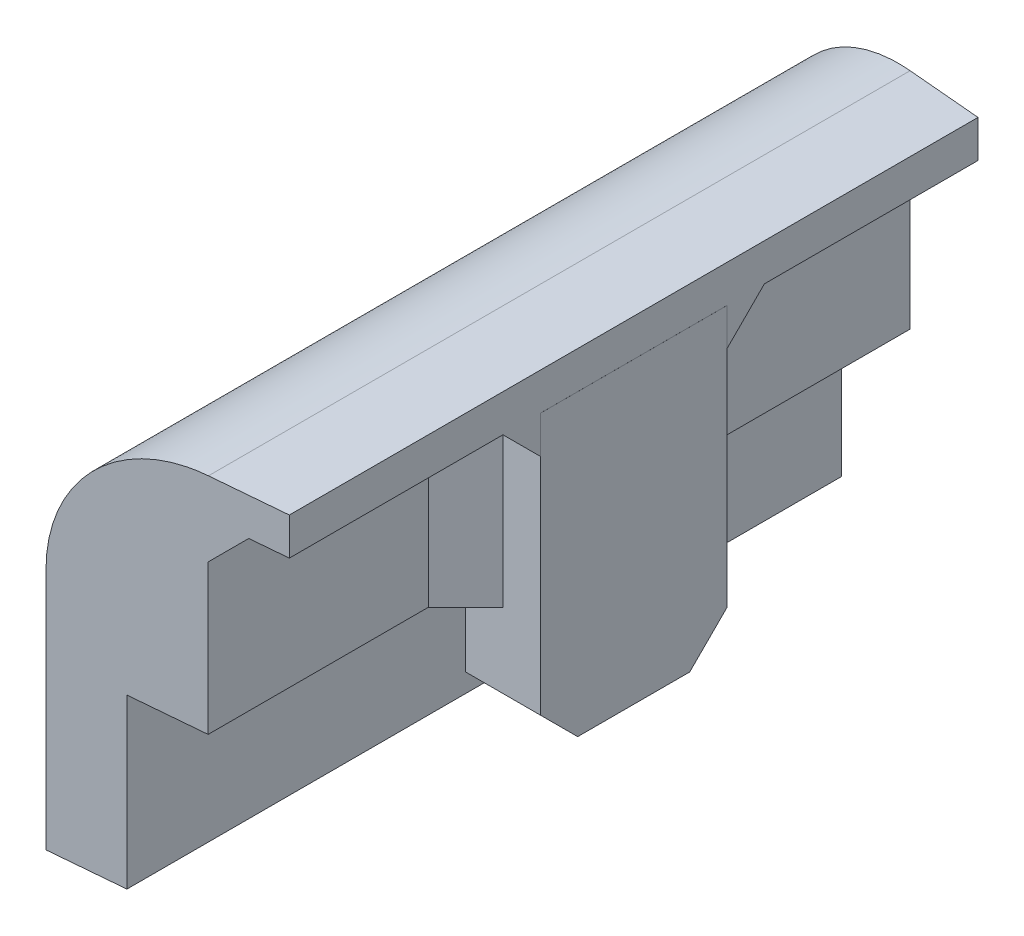
ISO-10303-21;
HEADER;
FILE_DESCRIPTION(('STEP AP214'),'2;1');
FILE_NAME('part.step','',(''),(''),'','','');
FILE_SCHEMA(('AUTOMOTIVE_DESIGN { 1 0 10303 214 1 1 1 1 }'));
ENDSEC;
DATA;
#1=APPLICATION_CONTEXT('core data for automotive mechanical design processes');
#2=APPLICATION_PROTOCOL_DEFINITION('international standard','automotive_design',2000,#1);
#3=PRODUCT_CONTEXT('',#1,'mechanical');
#4=PRODUCT('Part','Part','',(#3));
#5=PRODUCT_RELATED_PRODUCT_CATEGORY('part','',(#4));
#6=PRODUCT_DEFINITION_FORMATION('','',#4);
#7=PRODUCT_DEFINITION_CONTEXT('part definition',#1,'design');
#8=PRODUCT_DEFINITION('design','',#6,#7);
#9=PRODUCT_DEFINITION_SHAPE('','',#8);
#10=(LENGTH_UNIT() NAMED_UNIT(*) SI_UNIT(.MILLI.,.METRE.));
#11=(NAMED_UNIT(*) PLANE_ANGLE_UNIT() SI_UNIT($,.RADIAN.));
#12=(NAMED_UNIT(*) SI_UNIT($,.STERADIAN.) SOLID_ANGLE_UNIT());
#13=UNCERTAINTY_MEASURE_WITH_UNIT(LENGTH_MEASURE(1.E-05),#10,'distance_accuracy_value','');
#14=(GEOMETRIC_REPRESENTATION_CONTEXT(3) GLOBAL_UNCERTAINTY_ASSIGNED_CONTEXT((#13)) GLOBAL_UNIT_ASSIGNED_CONTEXT((#10,
#11,#12)) REPRESENTATION_CONTEXT('',''));
#15=CARTESIAN_POINT('',(0.,0.,0.));
#16=DIRECTION('',(0.,0.,1.));
#17=DIRECTION('',(1.,0.,0.));
#18=AXIS2_PLACEMENT_3D('',#15,#16,#17);
#19=CARTESIAN_POINT('',(-298.45,53.975,-137.123661696205));
#20=DIRECTION('',(1.,0.,0.));
#21=DIRECTION('',(0.,0.,-1.));
#22=AXIS2_PLACEMENT_3D('',#19,#20,#21);
#23=PLANE('',#22);
#24=DIRECTION('',(0.,1.,0.));
#25=VECTOR('',#24,1.);
#26=CARTESIAN_POINT('',(-298.45,53.975,22.225));
#27=LINE('',#26,#25);
#28=CARTESIAN_POINT('',(-298.45,53.975,22.225));
#29=VERTEX_POINT('',#28);
#30=CARTESIAN_POINT('',(-298.45,79.375,22.225));
#31=VERTEX_POINT('',#30);
#32=EDGE_CURVE('E352',#29,#31,#27,.T.);
#33=ORIENTED_EDGE('',*,*,#32,.T.);
#34=DIRECTION('',(0.,0.,1.));
#35=VECTOR('',#34,1.);
#36=CARTESIAN_POINT('',(-298.45,79.375,59.6568879883109));
#37=LINE('',#36,#35);
#38=CARTESIAN_POINT('',(-298.45,79.375,59.6568879883109));
#39=VERTEX_POINT('',#38);
#40=EDGE_CURVE('E354',#31,#39,#37,.T.);
#41=ORIENTED_EDGE('',*,*,#40,.T.);
#42=DIRECTION('',(0.,1.,0.));
#43=VECTOR('',#42,1.);
#44=CARTESIAN_POINT('',(-298.45,53.975,59.6568879883109));
#45=LINE('',#44,#43);
#46=CARTESIAN_POINT('',(-298.45,53.975,59.6568879883109));
#47=VERTEX_POINT('',#46);
#48=EDGE_CURVE('E258',#47,#39,#45,.T.);
#49=ORIENTED_EDGE('',*,*,#48,.F.);
#50=DIRECTION('',(0.,0.,1.));
#51=VECTOR('',#50,1.);
#52=CARTESIAN_POINT('',(-298.45,53.975,-137.123661696205));
#53=LINE('',#52,#51);
#54=EDGE_CURVE('E276',#29,#47,#53,.T.);
#55=ORIENTED_EDGE('',*,*,#54,.F.);
#56=EDGE_LOOP('',(#33,#41,#49,#55));
#57=FACE_BOUND('',#56,.T.);
#58=ADVANCED_FACE('F35',(#57),#23,.T.);
#59=DIRECTION('',(0.,1.,0.));
#60=VECTOR('',#59,1.);
#61=CARTESIAN_POINT('',(-298.45,53.975,-59.6568879883109));
#62=LINE('',#61,#60);
#63=CARTESIAN_POINT('',(-298.45,53.975,-59.6568879883109));
#64=VERTEX_POINT('',#63);
#65=CARTESIAN_POINT('',(-298.45,79.375,-59.6568879883109));
#66=VERTEX_POINT('',#65);
#67=EDGE_CURVE('E305',#64,#66,#62,.T.);
#68=ORIENTED_EDGE('',*,*,#67,.T.);
#69=DIRECTION('',(0.,0.,1.));
#70=VECTOR('',#69,1.);
#71=CARTESIAN_POINT('',(-298.45,79.375,-15.875));
#72=LINE('',#71,#70);
#73=CARTESIAN_POINT('',(-298.45,79.375,-22.225));
#74=VERTEX_POINT('',#73);
#75=EDGE_CURVE('E350',#66,#74,#72,.T.);
#76=ORIENTED_EDGE('',*,*,#75,.T.);
#77=DIRECTION('',(0.,-1.,0.));
#78=VECTOR('',#77,1.);
#79=CARTESIAN_POINT('',(-298.45,53.975,-22.225));
#80=LINE('',#79,#78);
#81=CARTESIAN_POINT('',(-298.45,53.975,-22.225));
#82=VERTEX_POINT('',#81);
#83=EDGE_CURVE('E348',#74,#82,#80,.T.);
#84=ORIENTED_EDGE('',*,*,#83,.T.);
#85=EDGE_CURVE('E273',#64,#82,#53,.T.);
#86=ORIENTED_EDGE('',*,*,#85,.F.);
#87=EDGE_LOOP('',(#68,#76,#84,#86));
#88=FACE_BOUND('',#87,.T.);
#89=ADVANCED_FACE('F440',(#88),#23,.T.);
#90=CARTESIAN_POINT('',(-298.45,85.725,-137.123661696205));
#91=DIRECTION('',(0.,-1.,0.));
#92=DIRECTION('',(0.,0.,-1.));
#93=AXIS2_PLACEMENT_3D('',#90,#91,#92);
#94=PLANE('',#93);
#95=DIRECTION('',(0.996194698091746,0.,-0.087155742747653));
#96=VECTOR('',#95,1.);
#97=CARTESIAN_POINT('',(-305.175982042056,85.725,60.2453351680697));
#98=LINE('',#97,#96);
#99=CARTESIAN_POINT('',(-292.1,85.725,59.1013349749214));
#100=VERTEX_POINT('',#99);
#101=CARTESIAN_POINT('',(-285.755139405586,85.725,58.5462316012577));
#102=VERTEX_POINT('',#101);
#103=EDGE_CURVE('E261',#100,#102,#98,.T.);
#104=ORIENTED_EDGE('',*,*,#103,.F.);
#105=DIRECTION('',(0.,0.,-1.));
#106=VECTOR('',#105,1.);
#107=CARTESIAN_POINT('',(-292.1,85.725,15.875));
#108=LINE('',#107,#106);
#109=CARTESIAN_POINT('',(-292.1,85.725,22.225));
#110=VERTEX_POINT('',#109);
#111=EDGE_CURVE('E359',#100,#110,#108,.T.);
#112=ORIENTED_EDGE('',*,*,#111,.T.);
#113=DIRECTION('',(1.,0.,0.));
#114=VECTOR('',#113,1.);
#115=CARTESIAN_POINT('',(-298.45,85.725,22.225));
#116=LINE('',#115,#114);
#117=CARTESIAN_POINT('',(-285.755139405586,85.725,22.225));
#118=VERTEX_POINT('',#117);
#119=EDGE_CURVE('E357',#110,#118,#116,.T.);
#120=ORIENTED_EDGE('',*,*,#119,.T.);
#121=DIRECTION('',(0.,0.,1.));
#122=VECTOR('',#121,1.);
#123=CARTESIAN_POINT('',(-285.755139405586,85.725,-137.123661696205));
#124=LINE('',#123,#122);
#125=EDGE_CURVE('E272',#118,#102,#124,.T.);
#126=ORIENTED_EDGE('',*,*,#125,.T.);
#127=EDGE_LOOP('',(#104,#112,#120,#126));
#128=FACE_BOUND('',#127,.T.);
#129=ADVANCED_FACE('F438',(#128),#94,.T.);
#130=CARTESIAN_POINT('',(-285.755139405586,85.725,-58.5462316012577));
#131=VERTEX_POINT('',#130);
#132=CARTESIAN_POINT('',(-285.755139405586,85.725,-22.225));
#133=VERTEX_POINT('',#132);
#134=EDGE_CURVE('E267',#131,#133,#124,.T.);
#135=ORIENTED_EDGE('',*,*,#134,.T.);
#136=DIRECTION('',(-1.,0.,0.));
#137=VECTOR('',#136,1.);
#138=CARTESIAN_POINT('',(-298.45,85.725,-22.225));
#139=LINE('',#138,#137);
#140=CARTESIAN_POINT('',(-292.1,85.725,-22.225));
#141=VERTEX_POINT('',#140);
#142=EDGE_CURVE('E345',#133,#141,#139,.T.);
#143=ORIENTED_EDGE('',*,*,#142,.T.);
#144=DIRECTION('',(0.,0.,-1.));
#145=VECTOR('',#144,1.);
#146=CARTESIAN_POINT('',(-292.1,85.725,-59.6568879883109));
#147=LINE('',#146,#145);
#148=CARTESIAN_POINT('',(-292.1,85.725,-59.1013349749214));
#149=VERTEX_POINT('',#148);
#150=EDGE_CURVE('E343',#141,#149,#147,.T.);
#151=ORIENTED_EDGE('',*,*,#150,.T.);
#152=DIRECTION('',(0.996194698091746,0.,0.087155742747653));
#153=VECTOR('',#152,1.);
#154=CARTESIAN_POINT('',(-305.175982042056,85.725,-60.2453351680697));
#155=LINE('',#154,#153);
#156=EDGE_CURVE('E308',#149,#131,#155,.T.);
#157=ORIENTED_EDGE('',*,*,#156,.T.);
#158=EDGE_LOOP('',(#135,#143,#151,#157));
#159=FACE_BOUND('',#158,.T.);
#160=ADVANCED_FACE('F427',(#159),#94,.T.);
#161=CARTESIAN_POINT('',(-285.755139405586,92.075,-137.123661696205));
#162=DIRECTION('',(0.,1.,0.));
#163=DIRECTION('',(-1.,0.,0.));
#164=AXIS2_PLACEMENT_3D('',#161,#162,#163);
#165=PLANE('',#164);
#166=DIRECTION('',(0.,0.,1.));
#167=VECTOR('',#166,1.);
#168=CARTESIAN_POINT('',(-285.755139405586,92.075,-137.123661696205));
#169=LINE('',#168,#167);
#170=CARTESIAN_POINT('',(-285.755139405586,92.075,-58.5462316012577));
#171=VERTEX_POINT('',#170);
#172=CARTESIAN_POINT('',(-285.755139405586,92.075,58.5462316012577));
#173=VERTEX_POINT('',#172);
#174=EDGE_CURVE('E266',#171,#173,#169,.T.);
#175=ORIENTED_EDGE('',*,*,#174,.F.);
#176=DIRECTION('',(-0.996194698091746,0.,-0.087155742747653));
#177=VECTOR('',#176,1.);
#178=CARTESIAN_POINT('',(-292.577553176455,92.0749999999996,-59.1431154640919));
#179=LINE('',#178,#177);
#180=CARTESIAN_POINT('',(-298.401672665765,92.0749999999992,-59.6526598944269));
#181=VERTEX_POINT('',#180);
#182=EDGE_CURVE('E270',#171,#181,#179,.T.);
#183=ORIENTED_EDGE('',*,*,#182,.T.);
#184=DIRECTION('',(0.,0.,1.));
#185=VECTOR('',#184,1.);
#186=CARTESIAN_POINT('',(-298.401672665765,92.0749999999992,-137.123661696205));
#187=LINE('',#186,#185);
#188=CARTESIAN_POINT('',(-298.401672665765,92.0749999999992,59.6526598944269));
#189=VERTEX_POINT('',#188);
#190=EDGE_CURVE('E285',#181,#189,#187,.T.);
#191=ORIENTED_EDGE('',*,*,#190,.T.);
#192=DIRECTION('',(-0.996194698091746,0.,0.087155742747653));
#193=VECTOR('',#192,1.);
#194=CARTESIAN_POINT('',(-292.577553176455,92.0749999999996,59.1431154640919));
#195=LINE('',#194,#193);
#196=EDGE_CURVE('E240',#173,#189,#195,.T.);
#197=ORIENTED_EDGE('',*,*,#196,.F.);
#198=EDGE_LOOP('',(#175,#183,#191,#197));
#199=FACE_BOUND('',#198,.T.);
#200=ADVANCED_FACE('F435',(#199),#165,.T.);
#201=CARTESIAN_POINT('',(-298.401672665765,66.675,-137.123661696205));
#202=DIRECTION('',(0.,0.,1.));
#203=DIRECTION('',(1.,0.,0.));
#204=AXIS2_PLACEMENT_3D('',#201,#202,#203);
#205=CYLINDRICAL_SURFACE('',#204,25.3999999999994);
#206=ORIENTED_EDGE('',*,*,#190,.F.);
#207=CARTESIAN_POINT('',(-298.401672665765,66.675,-59.652659894427));
#208=DIRECTION('',(0.087155742747653,0.,-0.996194698091746));
#209=DIRECTION('',(0.996194698091746,0.,0.087155742747653));
#210=AXIS2_PLACEMENT_3D('',#207,#208,#209);
#211=ELLIPSE('',#210,25.4970238736004,25.3999999999994);
#212=CARTESIAN_POINT('',(-323.801672665765,66.675,-61.8748719479854));
#213=VERTEX_POINT('',#212);
#214=EDGE_CURVE('E290',#181,#213,#211,.F.);
#215=ORIENTED_EDGE('',*,*,#214,.T.);
#216=DIRECTION('',(0.,0.,1.));
#217=VECTOR('',#216,1.);
#218=CARTESIAN_POINT('',(-323.801672665765,66.675,-137.123661696205));
#219=LINE('',#218,#217);
#220=CARTESIAN_POINT('',(-323.801672665765,66.675,61.8748719479854));
#221=VERTEX_POINT('',#220);
#222=EDGE_CURVE('E283',#213,#221,#219,.T.);
#223=ORIENTED_EDGE('',*,*,#222,.T.);
#224=CARTESIAN_POINT('',(-298.401672665765,66.675,59.652659894427));
#225=DIRECTION('',(-0.087155742747653,0.,-0.996194698091746));
#226=DIRECTION('',(0.996194698091746,0.,-0.087155742747653));
#227=AXIS2_PLACEMENT_3D('',#224,#225,#226);
#228=ELLIPSE('',#227,25.4970238736004,25.3999999999994);
#229=EDGE_CURVE('E243',#189,#221,#228,.F.);
#230=ORIENTED_EDGE('',*,*,#229,.F.);
#231=EDGE_LOOP('',(#206,#215,#223,#230));
#232=FACE_BOUND('',#231,.T.);
#233=ADVANCED_FACE('F466',(#232),#205,.T.);
#234=CARTESIAN_POINT('',(-323.801672665765,66.675,-137.123661696205));
#235=DIRECTION('',(-1.,0.,0.));
#236=DIRECTION('',(0.,-1.,0.));
#237=AXIS2_PLACEMENT_3D('',#234,#235,#236);
#238=PLANE('',#237);
#239=ORIENTED_EDGE('',*,*,#222,.F.);
#240=DIRECTION('',(0.,-1.,0.));
#241=VECTOR('',#240,1.);
#242=CARTESIAN_POINT('',(-323.801672665765,66.675,-61.8748719479853));
#243=LINE('',#242,#241);
#244=CARTESIAN_POINT('',(-323.801672665765,25.4,-61.8748719479854));
#245=VERTEX_POINT('',#244);
#246=EDGE_CURVE('E293',#213,#245,#243,.T.);
#247=ORIENTED_EDGE('',*,*,#246,.T.);
#248=DIRECTION('',(0.,0.,1.));
#249=VECTOR('',#248,1.);
#250=CARTESIAN_POINT('',(-323.801672665765,25.4,-137.123661696205));
#251=LINE('',#250,#249);
#252=CARTESIAN_POINT('',(-323.801672665765,25.4,61.8748719479854));
#253=VERTEX_POINT('',#252);
#254=EDGE_CURVE('E281',#245,#253,#251,.T.);
#255=ORIENTED_EDGE('',*,*,#254,.T.);
#256=DIRECTION('',(0.,-1.,0.));
#257=VECTOR('',#256,1.);
#258=CARTESIAN_POINT('',(-323.801672665765,66.675,61.8748719479853));
#259=LINE('',#258,#257);
#260=EDGE_CURVE('E246',#221,#253,#259,.T.);
#261=ORIENTED_EDGE('',*,*,#260,.F.);
#262=EDGE_LOOP('',(#239,#247,#255,#261));
#263=FACE_BOUND('',#262,.T.);
#264=ADVANCED_FACE('F462',(#263),#238,.T.);
#265=CARTESIAN_POINT('',(-323.801672665765,25.4,-137.123661696205));
#266=DIRECTION('',(0.,-1.,0.));
#267=DIRECTION('',(1.,0.,0.));
#268=AXIS2_PLACEMENT_3D('',#265,#266,#267);
#269=PLANE('',#268);
#270=ORIENTED_EDGE('',*,*,#254,.F.);
#271=DIRECTION('',(0.996194698091746,0.,0.087155742747653));
#272=VECTOR('',#271,1.);
#273=CARTESIAN_POINT('',(-330.335080271475,25.4,-62.4464710476789));
#274=LINE('',#273,#272);
#275=CARTESIAN_POINT('',(-311.15,25.4,-60.7679940150902));
#276=VERTEX_POINT('',#275);
#277=EDGE_CURVE('E296',#245,#276,#274,.T.);
#278=ORIENTED_EDGE('',*,*,#277,.T.);
#279=DIRECTION('',(0.,0.,1.));
#280=VECTOR('',#279,1.);
#281=CARTESIAN_POINT('',(-311.15,25.4,-137.123661696205));
#282=LINE('',#281,#280);
#283=CARTESIAN_POINT('',(-311.15,25.4,60.7679940150902));
#284=VERTEX_POINT('',#283);
#285=EDGE_CURVE('E279',#276,#284,#282,.T.);
#286=ORIENTED_EDGE('',*,*,#285,.T.);
#287=DIRECTION('',(0.996194698091746,0.,-0.087155742747653));
#288=VECTOR('',#287,1.);
#289=CARTESIAN_POINT('',(-330.335080271475,25.4,62.4464710476789));
#290=LINE('',#289,#288);
#291=EDGE_CURVE('E249',#253,#284,#290,.T.);
#292=ORIENTED_EDGE('',*,*,#291,.F.);
#293=EDGE_LOOP('',(#270,#278,#286,#292));
#294=FACE_BOUND('',#293,.T.);
#295=ADVANCED_FACE('F458',(#294),#269,.T.);
#296=CARTESIAN_POINT('',(-311.15,25.4,-137.123661696205));
#297=DIRECTION('',(1.,0.,0.));
#298=DIRECTION('',(0.,0.,-1.));
#299=AXIS2_PLACEMENT_3D('',#296,#297,#298);
#300=PLANE('',#299);
#301=ORIENTED_EDGE('',*,*,#285,.F.);
#302=DIRECTION('',(0.,1.,0.));
#303=VECTOR('',#302,1.);
#304=CARTESIAN_POINT('',(-311.15,25.4,-60.7679940150901));
#305=LINE('',#304,#303);
#306=CARTESIAN_POINT('',(-311.15,53.975,-60.7679940150902));
#307=VERTEX_POINT('',#306);
#308=EDGE_CURVE('E299',#276,#307,#305,.T.);
#309=ORIENTED_EDGE('',*,*,#308,.T.);
#310=DIRECTION('',(0.,0.,1.));
#311=VECTOR('',#310,1.);
#312=CARTESIAN_POINT('',(-311.15,53.975,-137.123661696205));
#313=LINE('',#312,#311);
#314=CARTESIAN_POINT('',(-311.15,53.975,60.7679940150902));
#315=VERTEX_POINT('',#314);
#316=EDGE_CURVE('E277',#307,#315,#313,.T.);
#317=ORIENTED_EDGE('',*,*,#316,.T.);
#318=DIRECTION('',(0.,1.,0.));
#319=VECTOR('',#318,1.);
#320=CARTESIAN_POINT('',(-311.15,25.4,60.7679940150901));
#321=LINE('',#320,#319);
#322=EDGE_CURVE('E252',#284,#315,#321,.T.);
#323=ORIENTED_EDGE('',*,*,#322,.F.);
#324=EDGE_LOOP('',(#301,#309,#317,#323));
#325=FACE_BOUND('',#324,.T.);
#326=ADVANCED_FACE('F455',(#325),#300,.T.);
#327=CARTESIAN_POINT('',(-311.15,53.975,-137.123661696205));
#328=DIRECTION('',(0.,-1.,0.));
#329=DIRECTION('',(1.,0.,0.));
#330=AXIS2_PLACEMENT_3D('',#327,#328,#329);
#331=PLANE('',#330);
#332=ORIENTED_EDGE('',*,*,#316,.F.);
#333=DIRECTION('',(0.996194698091746,0.,0.087155742747653));
#334=VECTOR('',#333,1.);
#335=CARTESIAN_POINT('',(-317.779511273683,53.975,-61.3480010962547));
#336=LINE('',#335,#334);
#337=EDGE_CURVE('E302',#307,#64,#336,.T.);
#338=ORIENTED_EDGE('',*,*,#337,.T.);
#339=ORIENTED_EDGE('',*,*,#85,.T.);
#340=DIRECTION('',(0.70710678118655,0.,0.707106781186545));
#341=VECTOR('',#340,1.);
#342=CARTESIAN_POINT('',(-292.1,53.975,-15.875));
#343=LINE('',#342,#341);
#344=CARTESIAN_POINT('',(-292.1,53.975,-15.875));
#345=VERTEX_POINT('',#344);
#346=EDGE_CURVE('E365',#82,#345,#343,.T.);
#347=ORIENTED_EDGE('',*,*,#346,.T.);
#348=DIRECTION('',(1.,0.,0.));
#349=VECTOR('',#348,1.);
#350=CARTESIAN_POINT('',(-285.75,53.975,-15.875));
#351=LINE('',#350,#349);
#352=CARTESIAN_POINT('',(-298.45,53.975,-15.875));
#353=VERTEX_POINT('',#352);
#354=EDGE_CURVE('E60',#353,#345,#351,.T.);
#355=ORIENTED_EDGE('',*,*,#354,.F.);
#356=DIRECTION('',(0.,0.,1.));
#357=VECTOR('',#356,1.);
#358=CARTESIAN_POINT('',(-298.45,53.975,-137.123661696205));
#359=LINE('',#358,#357);
#360=CARTESIAN_POINT('',(-298.45,53.975,15.875));
#361=VERTEX_POINT('',#360);
#362=EDGE_CURVE('E220',#353,#361,#359,.T.);
#363=ORIENTED_EDGE('',*,*,#362,.T.);
#364=DIRECTION('',(-1.,0.,0.));
#365=VECTOR('',#364,1.);
#366=CARTESIAN_POINT('',(-285.75,53.975,15.875));
#367=LINE('',#366,#365);
#368=CARTESIAN_POINT('',(-292.1,53.975,15.875));
#369=VERTEX_POINT('',#368);
#370=EDGE_CURVE('E333',#369,#361,#367,.T.);
#371=ORIENTED_EDGE('',*,*,#370,.F.);
#372=DIRECTION('',(-0.707106781186547,0.,0.707106781186548));
#373=VECTOR('',#372,1.);
#374=CARTESIAN_POINT('',(-292.1,53.975,15.875));
#375=LINE('',#374,#373);
#376=EDGE_CURVE('E11',#369,#29,#375,.T.);
#377=ORIENTED_EDGE('',*,*,#376,.T.);
#378=ORIENTED_EDGE('',*,*,#54,.T.);
#379=DIRECTION('',(0.996194698091746,0.,-0.087155742747653));
#380=VECTOR('',#379,1.);
#381=CARTESIAN_POINT('',(-317.779511273683,53.975,61.3480010962547));
#382=LINE('',#381,#380);
#383=EDGE_CURVE('E255',#315,#47,#382,.T.);
#384=ORIENTED_EDGE('',*,*,#383,.F.);
#385=EDGE_LOOP('',(#332,#338,#339,#347,#355,#363,#371,#377,#378,#384));
#386=FACE_BOUND('',#385,.T.);
#387=ADVANCED_FACE('F404',(#386),#331,.T.);
#388=CARTESIAN_POINT('',(-285.755139405586,85.725,-137.123661696205));
#389=DIRECTION('',(1.,0.,0.));
#390=DIRECTION('',(0.,1.,0.));
#391=AXIS2_PLACEMENT_3D('',#388,#389,#390);
#392=PLANE('',#391);
#393=ORIENTED_EDGE('',*,*,#134,.F.);
#394=DIRECTION('',(0.,1.,0.));
#395=VECTOR('',#394,1.);
#396=CARTESIAN_POINT('',(-285.755139405586,85.7249999999999,-58.5462316012578));
#397=LINE('',#396,#395);
#398=EDGE_CURVE('E310',#131,#171,#397,.T.);
#399=ORIENTED_EDGE('',*,*,#398,.T.);
#400=ORIENTED_EDGE('',*,*,#174,.T.);
#401=DIRECTION('',(0.,1.,0.));
#402=VECTOR('',#401,1.);
#403=CARTESIAN_POINT('',(-285.755139405586,85.7249999999999,58.5462316012578));
#404=LINE('',#403,#402);
#405=EDGE_CURVE('E263',#102,#173,#404,.T.);
#406=ORIENTED_EDGE('',*,*,#405,.F.);
#407=ORIENTED_EDGE('',*,*,#125,.F.);
#408=DIRECTION('',(0.,-0.707106781186547,-0.707106781186548));
#409=VECTOR('',#408,1.);
#410=CARTESIAN_POINT('',(-285.755139405586,79.375,15.875));
#411=LINE('',#410,#409);
#412=CARTESIAN_POINT('',(-285.755139405586,79.375,15.875));
#413=VERTEX_POINT('',#412);
#414=EDGE_CURVE('E44',#118,#413,#411,.T.);
#415=ORIENTED_EDGE('',*,*,#414,.T.);
#416=DIRECTION('',(0.,-1.,0.));
#417=VECTOR('',#416,1.);
#418=CARTESIAN_POINT('',(-285.755139405586,34.925,15.875));
#419=LINE('',#418,#417);
#420=CARTESIAN_POINT('',(-285.755139405586,85.725,15.875));
#421=VERTEX_POINT('',#420);
#422=EDGE_CURVE('E52',#421,#413,#419,.T.);
#423=ORIENTED_EDGE('',*,*,#422,.F.);
#424=CARTESIAN_POINT('',(-285.755139405586,85.725,-15.875));
#425=VERTEX_POINT('',#424);
#426=EDGE_CURVE('E271',#425,#421,#124,.T.);
#427=ORIENTED_EDGE('',*,*,#426,.F.);
#428=DIRECTION('',(0.,1.,0.));
#429=VECTOR('',#428,1.);
#430=CARTESIAN_POINT('',(-285.755139405586,34.925,-15.875));
#431=LINE('',#430,#429);
#432=CARTESIAN_POINT('',(-285.755139405586,79.3749999999999,-15.875));
#433=VERTEX_POINT('',#432);
#434=EDGE_CURVE('E217',#433,#425,#431,.T.);
#435=ORIENTED_EDGE('',*,*,#434,.F.);
#436=DIRECTION('',(0.,0.70710678118655,-0.707106781186545));
#437=VECTOR('',#436,1.);
#438=CARTESIAN_POINT('',(-285.755139405586,85.7249999999999,-22.2249999999999));
#439=LINE('',#438,#437);
#440=EDGE_CURVE('E361',#433,#133,#439,.T.);
#441=ORIENTED_EDGE('',*,*,#440,.T.);
#442=EDGE_LOOP('',(#393,#399,#400,#406,#407,#415,#423,#427,#435,#441));
#443=FACE_BOUND('',#442,.T.);
#444=ADVANCED_FACE('F414',(#443),#392,.T.);
#445=CARTESIAN_POINT('',(5.11792374184178,0.,-33.0981360507992));
#446=DIRECTION('',(0.087155742747653,0.,-0.996194698091746));
#447=DIRECTION('',(-0.996194698091746,0.,-0.087155742747653));
#448=AXIS2_PLACEMENT_3D('',#445,#446,#447);
#449=PLANE('',#448);
#450=ORIENTED_EDGE('',*,*,#182,.F.);
#451=ORIENTED_EDGE('',*,*,#398,.F.);
#452=ORIENTED_EDGE('',*,*,#156,.F.);
#453=DIRECTION('',(0.705757556807954,0.70575755680795,0.0617457854184456));
#454=VECTOR('',#453,1.);
#455=CARTESIAN_POINT('',(-301.825812565598,75.9991874344018,-59.9522333179891));
#456=LINE('',#455,#454);
#457=EDGE_CURVE('E363',#149,#66,#456,.F.);
#458=ORIENTED_EDGE('',*,*,#457,.T.);
#459=ORIENTED_EDGE('',*,*,#67,.F.);
#460=ORIENTED_EDGE('',*,*,#337,.F.);
#461=ORIENTED_EDGE('',*,*,#308,.F.);
#462=ORIENTED_EDGE('',*,*,#277,.F.);
#463=ORIENTED_EDGE('',*,*,#246,.F.);
#464=ORIENTED_EDGE('',*,*,#214,.F.);
#465=EDGE_LOOP('',(#450,#451,#452,#458,#459,#460,#461,#462,#463,#464));
#466=FACE_BOUND('',#465,.T.);
#467=ADVANCED_FACE('F475',(#466),#449,.T.);
#468=CARTESIAN_POINT('',(5.11792374184178,0.,33.0981360507992));
#469=DIRECTION('',(0.087155742747653,0.,0.996194698091746));
#470=DIRECTION('',(-0.996194698091746,0.,0.087155742747653));
#471=AXIS2_PLACEMENT_3D('',#468,#469,#470);
#472=PLANE('',#471);
#473=ORIENTED_EDGE('',*,*,#196,.T.);
#474=ORIENTED_EDGE('',*,*,#229,.T.);
#475=ORIENTED_EDGE('',*,*,#260,.T.);
#476=ORIENTED_EDGE('',*,*,#291,.T.);
#477=ORIENTED_EDGE('',*,*,#322,.T.);
#478=ORIENTED_EDGE('',*,*,#383,.T.);
#479=ORIENTED_EDGE('',*,*,#48,.T.);
#480=DIRECTION('',(-0.705757556807952,-0.705757556807952,0.0617457854184454));
#481=VECTOR('',#480,1.);
#482=CARTESIAN_POINT('',(-289.874784840077,87.9502151599235,58.906653874522));
#483=LINE('',#482,#481);
#484=EDGE_CURVE('E367',#39,#100,#483,.F.);
#485=ORIENTED_EDGE('',*,*,#484,.T.);
#486=ORIENTED_EDGE('',*,*,#103,.T.);
#487=ORIENTED_EDGE('',*,*,#405,.T.);
#488=EDGE_LOOP('',(#473,#474,#475,#476,#477,#478,#479,#485,#486,#487));
#489=FACE_BOUND('',#488,.T.);
#490=ADVANCED_FACE('F399',(#489),#472,.T.);
#491=CARTESIAN_POINT('',(-285.75,34.925,15.875));
#492=DIRECTION('',(0.,0.,-1.));
#493=DIRECTION('',(-1.,0.,0.));
#494=AXIS2_PLACEMENT_3D('',#491,#492,#493);
#495=PLANE('',#494);
#496=DIRECTION('',(0.,-1.,0.));
#497=VECTOR('',#496,1.);
#498=CARTESIAN_POINT('',(-298.45,34.925,15.875));
#499=LINE('',#498,#497);
#500=CARTESIAN_POINT('',(-298.45,41.275,15.875));
#501=VERTEX_POINT('',#500);
#502=EDGE_CURVE('E229',#361,#501,#499,.T.);
#503=ORIENTED_EDGE('',*,*,#502,.T.);
#504=DIRECTION('',(1.,0.,0.));
#505=VECTOR('',#504,1.);
#506=CARTESIAN_POINT('',(-285.75,41.275,15.875));
#507=LINE('',#506,#505);
#508=CARTESIAN_POINT('',(-285.75,41.275,15.875));
#509=VERTEX_POINT('',#508);
#510=EDGE_CURVE('E341',#501,#509,#507,.T.);
#511=ORIENTED_EDGE('',*,*,#510,.T.);
#512=DIRECTION('',(0.,-1.,0.));
#513=VECTOR('',#512,1.);
#514=CARTESIAN_POINT('',(-285.75,34.925,15.875));
#515=LINE('',#514,#513);
#516=CARTESIAN_POINT('',(-285.75,85.725,15.875));
#517=VERTEX_POINT('',#516);
#518=EDGE_CURVE('E237',#517,#509,#515,.T.);
#519=ORIENTED_EDGE('',*,*,#518,.F.);
#520=DIRECTION('',(-1.,0.,0.));
#521=VECTOR('',#520,1.);
#522=CARTESIAN_POINT('',(-285.75,85.725,15.875));
#523=LINE('',#522,#521);
#524=EDGE_CURVE('E221',#517,#421,#523,.T.);
#525=ORIENTED_EDGE('',*,*,#524,.T.);
#526=ORIENTED_EDGE('',*,*,#422,.T.);
#527=DIRECTION('',(-1.,0.,0.));
#528=VECTOR('',#527,1.);
#529=CARTESIAN_POINT('',(-285.75,79.375,15.875));
#530=LINE('',#529,#528);
#531=CARTESIAN_POINT('',(-292.1,79.375,15.875));
#532=VERTEX_POINT('',#531);
#533=EDGE_CURVE('E338',#413,#532,#530,.T.);
#534=ORIENTED_EDGE('',*,*,#533,.T.);
#535=DIRECTION('',(0.,-1.,0.));
#536=VECTOR('',#535,1.);
#537=CARTESIAN_POINT('',(-292.1,34.925,15.875));
#538=LINE('',#537,#536);
#539=EDGE_CURVE('E335',#532,#369,#538,.T.);
#540=ORIENTED_EDGE('',*,*,#539,.T.);
#541=ORIENTED_EDGE('',*,*,#370,.T.);
#542=EDGE_LOOP('',(#503,#511,#519,#525,#526,#534,#540,#541));
#543=FACE_BOUND('',#542,.T.);
#544=ADVANCED_FACE('F410',(#543),#495,.F.);
#545=CARTESIAN_POINT('',(-285.75,34.925,-15.875));
#546=DIRECTION('',(0.,1.,0.));
#547=DIRECTION('',(0.,0.,1.));
#548=AXIS2_PLACEMENT_3D('',#545,#546,#547);
#549=PLANE('',#548);
#550=DIRECTION('',(0.,0.,-1.));
#551=VECTOR('',#550,1.);
#552=CARTESIAN_POINT('',(-298.45,34.925,-15.875));
#553=LINE('',#552,#551);
#554=CARTESIAN_POINT('',(-298.45,34.925,9.525));
#555=VERTEX_POINT('',#554);
#556=CARTESIAN_POINT('',(-298.45,34.925,-9.52499999999999));
#557=VERTEX_POINT('',#556);
#558=EDGE_CURVE('E232',#555,#557,#553,.T.);
#559=ORIENTED_EDGE('',*,*,#558,.T.);
#560=DIRECTION('',(1.,0.,0.));
#561=VECTOR('',#560,1.);
#562=CARTESIAN_POINT('',(-285.75,34.925,-9.52499999999999));
#563=LINE('',#562,#561);
#564=CARTESIAN_POINT('',(-285.75,34.925,-9.52499999999999));
#565=VERTEX_POINT('',#564);
#566=EDGE_CURVE('E328',#557,#565,#563,.T.);
#567=ORIENTED_EDGE('',*,*,#566,.T.);
#568=DIRECTION('',(0.,0.,-1.));
#569=VECTOR('',#568,1.);
#570=CARTESIAN_POINT('',(-285.75,34.925,-15.875));
#571=LINE('',#570,#569);
#572=CARTESIAN_POINT('',(-285.75,34.925,9.525));
#573=VERTEX_POINT('',#572);
#574=EDGE_CURVE('E211',#573,#565,#571,.T.);
#575=ORIENTED_EDGE('',*,*,#574,.F.);
#576=DIRECTION('',(-1.,0.,0.));
#577=VECTOR('',#576,1.);
#578=CARTESIAN_POINT('',(-285.75,34.925,9.525));
#579=LINE('',#578,#577);
#580=EDGE_CURVE('E325',#573,#555,#579,.T.);
#581=ORIENTED_EDGE('',*,*,#580,.T.);
#582=EDGE_LOOP('',(#559,#567,#575,#581));
#583=FACE_BOUND('',#582,.T.);
#584=ADVANCED_FACE('F558',(#583),#549,.F.);
#585=CARTESIAN_POINT('',(-285.75,34.925,-15.875));
#586=DIRECTION('',(0.,0.,1.));
#587=DIRECTION('',(1.,0.,0.));
#588=AXIS2_PLACEMENT_3D('',#585,#586,#587);
#589=PLANE('',#588);
#590=DIRECTION('',(0.,1.,0.));
#591=VECTOR('',#590,1.);
#592=CARTESIAN_POINT('',(-285.75,34.925,-15.875));
#593=LINE('',#592,#591);
#594=CARTESIAN_POINT('',(-285.75,41.275,-15.875));
#595=VERTEX_POINT('',#594);
#596=CARTESIAN_POINT('',(-285.75,85.725,-15.875));
#597=VERTEX_POINT('',#596);
#598=EDGE_CURVE('E198',#595,#597,#593,.T.);
#599=ORIENTED_EDGE('',*,*,#598,.F.);
#600=DIRECTION('',(-1.,0.,0.));
#601=VECTOR('',#600,1.);
#602=CARTESIAN_POINT('',(-285.75,41.275,-15.875));
#603=LINE('',#602,#601);
#604=CARTESIAN_POINT('',(-298.45,41.275,-15.875));
#605=VERTEX_POINT('',#604);
#606=EDGE_CURVE('E319',#595,#605,#603,.T.);
#607=ORIENTED_EDGE('',*,*,#606,.T.);
#608=DIRECTION('',(0.,1.,0.));
#609=VECTOR('',#608,1.);
#610=CARTESIAN_POINT('',(-298.45,34.925,-15.875));
#611=LINE('',#610,#609);
#612=EDGE_CURVE('E236',#605,#353,#611,.T.);
#613=ORIENTED_EDGE('',*,*,#612,.T.);
#614=ORIENTED_EDGE('',*,*,#354,.T.);
#615=DIRECTION('',(0.,1.,0.));
#616=VECTOR('',#615,1.);
#617=CARTESIAN_POINT('',(-292.1,34.925,-15.875));
#618=LINE('',#617,#616);
#619=CARTESIAN_POINT('',(-292.1,79.3749999999999,-15.875));
#620=VERTEX_POINT('',#619);
#621=EDGE_CURVE('E314',#345,#620,#618,.T.);
#622=ORIENTED_EDGE('',*,*,#621,.T.);
#623=DIRECTION('',(1.,0.,0.));
#624=VECTOR('',#623,1.);
#625=CARTESIAN_POINT('',(-285.75,79.3749999999999,-15.875));
#626=LINE('',#625,#624);
#627=EDGE_CURVE('E316',#620,#433,#626,.T.);
#628=ORIENTED_EDGE('',*,*,#627,.T.);
#629=ORIENTED_EDGE('',*,*,#434,.T.);
#630=DIRECTION('',(-1.,0.,0.));
#631=VECTOR('',#630,1.);
#632=CARTESIAN_POINT('',(-285.75,85.725,-15.875));
#633=LINE('',#632,#631);
#634=EDGE_CURVE('E214',#597,#425,#633,.T.);
#635=ORIENTED_EDGE('',*,*,#634,.F.);
#636=EDGE_LOOP('',(#599,#607,#613,#614,#622,#628,#629,#635));
#637=FACE_BOUND('',#636,.T.);
#638=ADVANCED_FACE('F215',(#637),#589,.F.);
#639=CARTESIAN_POINT('',(-285.75,85.725,-15.875));
#640=DIRECTION('',(0.,-1.,0.));
#641=DIRECTION('',(0.,0.,-1.));
#642=AXIS2_PLACEMENT_3D('',#639,#640,#641);
#643=PLANE('',#642);
#644=ORIENTED_EDGE('',*,*,#426,.T.);
#645=ORIENTED_EDGE('',*,*,#524,.F.);
#646=DIRECTION('',(0.,0.,1.));
#647=VECTOR('',#646,1.);
#648=CARTESIAN_POINT('',(-285.75,85.725,-15.875));
#649=LINE('',#648,#647);
#650=EDGE_CURVE('E204',#597,#517,#649,.T.);
#651=ORIENTED_EDGE('',*,*,#650,.F.);
#652=ORIENTED_EDGE('',*,*,#634,.T.);
#653=EDGE_LOOP('',(#644,#645,#651,#652));
#654=FACE_BOUND('',#653,.T.);
#655=ADVANCED_FACE('F223',(#654),#643,.F.);
#656=CARTESIAN_POINT('',(-285.75,0.,0.));
#657=DIRECTION('',(1.,0.,0.));
#658=DIRECTION('',(0.,0.,-1.));
#659=AXIS2_PLACEMENT_3D('',#656,#657,#658);
#660=PLANE('',#659);
#661=ORIENTED_EDGE('',*,*,#574,.T.);
#662=DIRECTION('',(0.,-0.707106781186546,0.707106781186549));
#663=VECTOR('',#662,1.);
#664=CARTESIAN_POINT('',(-285.75,12.7000000000001,12.7));
#665=LINE('',#664,#663);
#666=EDGE_CURVE('E207',#565,#595,#665,.F.);
#667=ORIENTED_EDGE('',*,*,#666,.T.);
#668=ORIENTED_EDGE('',*,*,#598,.T.);
#669=ORIENTED_EDGE('',*,*,#650,.T.);
#670=ORIENTED_EDGE('',*,*,#518,.T.);
#671=DIRECTION('',(0.,0.707106781186549,0.707106781186546));
#672=VECTOR('',#671,1.);
#673=CARTESIAN_POINT('',(-285.75,12.6999999999999,-12.7));
#674=LINE('',#673,#672);
#675=EDGE_CURVE('E330',#509,#573,#674,.F.);
#676=ORIENTED_EDGE('',*,*,#675,.T.);
#677=EDGE_LOOP('',(#661,#667,#668,#669,#670,#676));
#678=FACE_BOUND('',#677,.T.);
#679=ADVANCED_FACE('F201',(#678),#660,.T.);
#680=CARTESIAN_POINT('',(-298.45,0.,0.));
#681=DIRECTION('',(1.,0.,0.));
#682=DIRECTION('',(0.,0.,-1.));
#683=AXIS2_PLACEMENT_3D('',#680,#681,#682);
#684=PLANE('',#683);
#685=ORIENTED_EDGE('',*,*,#612,.F.);
#686=DIRECTION('',(0.,0.707106781186546,-0.707106781186549));
#687=VECTOR('',#686,1.);
#688=CARTESIAN_POINT('',(-298.45,41.275,-15.875));
#689=LINE('',#688,#687);
#690=EDGE_CURVE('E323',#605,#557,#689,.F.);
#691=ORIENTED_EDGE('',*,*,#690,.T.);
#692=ORIENTED_EDGE('',*,*,#558,.F.);
#693=DIRECTION('',(0.,-0.707106781186549,-0.707106781186546));
#694=VECTOR('',#693,1.);
#695=CARTESIAN_POINT('',(-298.45,34.925,9.525));
#696=LINE('',#695,#694);
#697=EDGE_CURVE('E321',#555,#501,#696,.F.);
#698=ORIENTED_EDGE('',*,*,#697,.T.);
#699=ORIENTED_EDGE('',*,*,#502,.F.);
#700=ORIENTED_EDGE('',*,*,#362,.F.);
#701=EDGE_LOOP('',(#685,#691,#692,#698,#699,#700));
#702=FACE_BOUND('',#701,.T.);
#703=ADVANCED_FACE('F480',(#702),#684,.F.);
#704=CARTESIAN_POINT('',(-285.75,41.275,-15.875));
#705=DIRECTION('',(0.,0.707106781186549,0.707106781186546));
#706=DIRECTION('',(-1.,0.,0.));
#707=AXIS2_PLACEMENT_3D('',#704,#705,#706);
#708=PLANE('',#707);
#709=ORIENTED_EDGE('',*,*,#666,.F.);
#710=ORIENTED_EDGE('',*,*,#566,.F.);
#711=ORIENTED_EDGE('',*,*,#690,.F.);
#712=ORIENTED_EDGE('',*,*,#606,.F.);
#713=EDGE_LOOP('',(#709,#710,#711,#712));
#714=FACE_BOUND('',#713,.T.);
#715=ADVANCED_FACE('F476',(#714),#708,.F.);
#716=CARTESIAN_POINT('',(-285.75,34.925,9.525));
#717=DIRECTION('',(0.,0.707106781186546,-0.707106781186549));
#718=DIRECTION('',(-1.,0.,0.));
#719=AXIS2_PLACEMENT_3D('',#716,#717,#718);
#720=PLANE('',#719);
#721=ORIENTED_EDGE('',*,*,#675,.F.);
#722=ORIENTED_EDGE('',*,*,#510,.F.);
#723=ORIENTED_EDGE('',*,*,#697,.F.);
#724=ORIENTED_EDGE('',*,*,#580,.F.);
#725=EDGE_LOOP('',(#721,#722,#723,#724));
#726=FACE_BOUND('',#725,.T.);
#727=ADVANCED_FACE('F479',(#726),#720,.F.);
#728=CARTESIAN_POINT('',(-298.45,79.375,-137.123661696205));
#729=DIRECTION('',(0.707106781186545,-0.70710678118655,0.));
#730=DIRECTION('',(0.,0.,-1.));
#731=AXIS2_PLACEMENT_3D('',#728,#729,#730);
#732=PLANE('',#731);
#733=ORIENTED_EDGE('',*,*,#457,.F.);
#734=ORIENTED_EDGE('',*,*,#150,.F.);
#735=DIRECTION('',(-0.70710678118655,-0.707106781186545,0.));
#736=VECTOR('',#735,1.);
#737=CARTESIAN_POINT('',(-292.1,85.725,-22.225));
#738=LINE('',#737,#736);
#739=EDGE_CURVE('E233',#74,#141,#738,.F.);
#740=ORIENTED_EDGE('',*,*,#739,.F.);
#741=ORIENTED_EDGE('',*,*,#75,.F.);
#742=EDGE_LOOP('',(#733,#734,#740,#741));
#743=FACE_BOUND('',#742,.T.);
#744=ADVANCED_FACE('F484',(#743),#732,.T.);
#745=CARTESIAN_POINT('',(-292.1,34.925,-15.875));
#746=DIRECTION('',(-0.707106781186545,0.,0.70710678118655));
#747=DIRECTION('',(0.,1.,0.));
#748=AXIS2_PLACEMENT_3D('',#745,#746,#747);
#749=PLANE('',#748);
#750=ORIENTED_EDGE('',*,*,#346,.F.);
#751=ORIENTED_EDGE('',*,*,#83,.F.);
#752=DIRECTION('',(-0.70710678118655,0.,-0.707106781186545));
#753=VECTOR('',#752,1.);
#754=CARTESIAN_POINT('',(-295.275,79.375,-19.05));
#755=LINE('',#754,#753);
#756=EDGE_CURVE('E372',#620,#74,#755,.T.);
#757=ORIENTED_EDGE('',*,*,#756,.F.);
#758=ORIENTED_EDGE('',*,*,#621,.F.);
#759=EDGE_LOOP('',(#750,#751,#757,#758));
#760=FACE_BOUND('',#759,.T.);
#761=ADVANCED_FACE('F491',(#760),#749,.F.);
#762=CARTESIAN_POINT('',(-292.1,85.725,-22.225));
#763=DIRECTION('',(0.577350269189622,-0.577350269189626,-0.57735026918963));
#764=DIRECTION('',(0.,0.70710678118655,-0.707106781186545));
#765=AXIS2_PLACEMENT_3D('',#762,#763,#764);
#766=PLANE('',#765);
#767=ORIENTED_EDGE('',*,*,#756,.T.);
#768=ORIENTED_EDGE('',*,*,#739,.T.);
#769=DIRECTION('',(0.,-0.70710678118655,0.707106781186545));
#770=VECTOR('',#769,1.);
#771=CARTESIAN_POINT('',(-292.1,85.725,-22.225));
#772=LINE('',#771,#770);
#773=EDGE_CURVE('E370',#620,#141,#772,.F.);
#774=ORIENTED_EDGE('',*,*,#773,.F.);
#775=EDGE_LOOP('',(#767,#768,#774));
#776=FACE_BOUND('',#775,.T.);
#777=ADVANCED_FACE('F488',(#776),#766,.T.);
#778=CARTESIAN_POINT('',(-298.45,85.725,-22.225));
#779=DIRECTION('',(0.,0.707106781186545,0.70710678118655));
#780=DIRECTION('',(-1.,0.,0.));
#781=AXIS2_PLACEMENT_3D('',#778,#779,#780);
#782=PLANE('',#781);
#783=ORIENTED_EDGE('',*,*,#440,.F.);
#784=ORIENTED_EDGE('',*,*,#627,.F.);
#785=ORIENTED_EDGE('',*,*,#773,.T.);
#786=ORIENTED_EDGE('',*,*,#142,.F.);
#787=EDGE_LOOP('',(#783,#784,#785,#786));
#788=FACE_BOUND('',#787,.T.);
#789=ADVANCED_FACE('F425',(#788),#782,.F.);
#790=CARTESIAN_POINT('',(-285.75,79.375,15.875));
#791=DIRECTION('',(0.,0.707106781186548,-0.707106781186547));
#792=DIRECTION('',(-1.,0.,0.));
#793=AXIS2_PLACEMENT_3D('',#790,#791,#792);
#794=PLANE('',#793);
#795=ORIENTED_EDGE('',*,*,#414,.F.);
#796=ORIENTED_EDGE('',*,*,#119,.F.);
#797=DIRECTION('',(0.,0.707106781186547,0.707106781186548));
#798=VECTOR('',#797,1.);
#799=CARTESIAN_POINT('',(-292.1,85.725,22.225));
#800=LINE('',#799,#798);
#801=EDGE_CURVE('E39',#532,#110,#800,.T.);
#802=ORIENTED_EDGE('',*,*,#801,.F.);
#803=ORIENTED_EDGE('',*,*,#533,.F.);
#804=EDGE_LOOP('',(#795,#796,#802,#803));
#805=FACE_BOUND('',#804,.T.);
#806=ADVANCED_FACE('F37',(#805),#794,.F.);
#807=CARTESIAN_POINT('',(-292.1,34.925,15.875));
#808=DIRECTION('',(-0.707106781186548,0.,-0.707106781186547));
#809=DIRECTION('',(0.,-1.,0.));
#810=AXIS2_PLACEMENT_3D('',#807,#808,#809);
#811=PLANE('',#810);
#812=ORIENTED_EDGE('',*,*,#376,.F.);
#813=ORIENTED_EDGE('',*,*,#539,.F.);
#814=DIRECTION('',(0.707106781186547,0.,-0.707106781186548));
#815=VECTOR('',#814,1.);
#816=CARTESIAN_POINT('',(-295.275,79.375,19.05));
#817=LINE('',#816,#815);
#818=EDGE_CURVE('E379',#31,#532,#817,.T.);
#819=ORIENTED_EDGE('',*,*,#818,.F.);
#820=ORIENTED_EDGE('',*,*,#32,.F.);
#821=EDGE_LOOP('',(#812,#813,#819,#820));
#822=FACE_BOUND('',#821,.T.);
#823=ADVANCED_FACE('F407',(#822),#811,.F.);
#824=CARTESIAN_POINT('',(-292.1,85.725,22.225));
#825=DIRECTION('',(0.577350269189626,-0.577350269189626,0.577350269189626));
#826=DIRECTION('',(0.707106781186548,0.707106781186548,0.));
#827=AXIS2_PLACEMENT_3D('',#824,#825,#826);
#828=PLANE('',#827);
#829=ORIENTED_EDGE('',*,*,#818,.T.);
#830=ORIENTED_EDGE('',*,*,#801,.T.);
#831=DIRECTION('',(0.707106781186547,0.707106781186547,0.));
#832=VECTOR('',#831,1.);
#833=CARTESIAN_POINT('',(-292.1,85.725,22.225));
#834=LINE('',#833,#832);
#835=EDGE_CURVE('E377',#31,#110,#834,.T.);
#836=ORIENTED_EDGE('',*,*,#835,.F.);
#837=EDGE_LOOP('',(#829,#830,#836));
#838=FACE_BOUND('',#837,.T.);
#839=ADVANCED_FACE('F386',(#838),#828,.T.);
#840=CARTESIAN_POINT('',(-298.45,79.375,-137.123661696205));
#841=DIRECTION('',(0.707106781186548,-0.707106781186548,0.));
#842=DIRECTION('',(0.,0.,-1.));
#843=AXIS2_PLACEMENT_3D('',#840,#841,#842);
#844=PLANE('',#843);
#845=ORIENTED_EDGE('',*,*,#835,.T.);
#846=ORIENTED_EDGE('',*,*,#111,.F.);
#847=ORIENTED_EDGE('',*,*,#484,.F.);
#848=ORIENTED_EDGE('',*,*,#40,.F.);
#849=EDGE_LOOP('',(#845,#846,#847,#848));
#850=FACE_BOUND('',#849,.T.);
#851=ADVANCED_FACE('F393',(#850),#844,.T.);
#852=CLOSED_SHELL('',(#58,#89,#129,#160,#200,#233,#264,#295,#326,#387,#444,#467,#490,#544,#584,
#638,#655,#679,#703,#715,#727,#744,#761,#777,#789,#806,#823,#839,#851));
#853=MANIFOLD_SOLID_BREP('B2',#852);
#854=ADVANCED_BREP_SHAPE_REPRESENTATION('',(#18,#853),#14);
#855=SHAPE_DEFINITION_REPRESENTATION(#9,#854);
ENDSEC;
END-ISO-10303-21;
